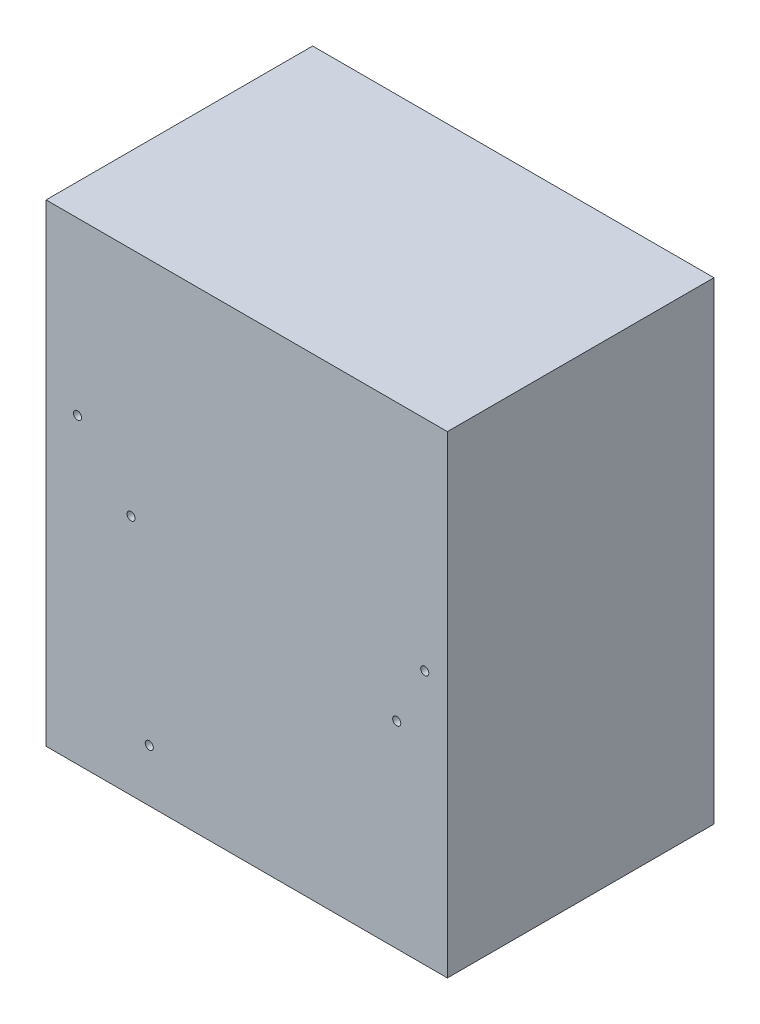
ISO-10303-21;
HEADER;
FILE_DESCRIPTION(('STEP AP214'),'2;1');
FILE_NAME('part.step','',(''),(''),'','','');
FILE_SCHEMA(('AUTOMOTIVE_DESIGN { 1 0 10303 214 1 1 1 1 }'));
ENDSEC;
DATA;
#1=APPLICATION_CONTEXT('core data for automotive mechanical design processes');
#2=APPLICATION_PROTOCOL_DEFINITION('international standard','automotive_design',2000,#1);
#3=PRODUCT_CONTEXT('',#1,'mechanical');
#4=PRODUCT('Part','Part','',(#3));
#5=PRODUCT_RELATED_PRODUCT_CATEGORY('part','',(#4));
#6=PRODUCT_DEFINITION_FORMATION('','',#4);
#7=PRODUCT_DEFINITION_CONTEXT('part definition',#1,'design');
#8=PRODUCT_DEFINITION('design','',#6,#7);
#9=PRODUCT_DEFINITION_SHAPE('','',#8);
#10=(LENGTH_UNIT() NAMED_UNIT(*) SI_UNIT(.MILLI.,.METRE.));
#11=(NAMED_UNIT(*) PLANE_ANGLE_UNIT() SI_UNIT($,.RADIAN.));
#12=(NAMED_UNIT(*) SI_UNIT($,.STERADIAN.) SOLID_ANGLE_UNIT());
#13=UNCERTAINTY_MEASURE_WITH_UNIT(LENGTH_MEASURE(1.E-05),#10,'distance_accuracy_value','');
#14=(GEOMETRIC_REPRESENTATION_CONTEXT(3) GLOBAL_UNCERTAINTY_ASSIGNED_CONTEXT((#13)) GLOBAL_UNIT_ASSIGNED_CONTEXT((#10,
#11,#12)) REPRESENTATION_CONTEXT('',''));
#15=CARTESIAN_POINT('',(0.,0.,0.));
#16=DIRECTION('',(0.,0.,1.));
#17=DIRECTION('',(1.,0.,0.));
#18=AXIS2_PLACEMENT_3D('',#15,#16,#17);
#19=CARTESIAN_POINT('',(0.,0.,0.));
#20=DIRECTION('',(0.,0.,1.));
#21=DIRECTION('',(1.,0.,0.));
#22=AXIS2_PLACEMENT_3D('',#19,#20,#21);
#23=PLANE('',#22);
#24=CARTESIAN_POINT('',(126.445833012849,81.027999610437,0.));
#25=DIRECTION('',(0.,0.,1.));
#26=DIRECTION('',(1.,0.,0.));
#27=AXIS2_PLACEMENT_3D('',#24,#25,#26);
#28=CIRCLE('',#27,1.34999999999998);
#29=CARTESIAN_POINT('',(127.795833012849,81.027999610437,0.));
#30=VERTEX_POINT('',#29);
#31=EDGE_CURVE('E189',#30,#30,#28,.T.);
#32=ORIENTED_EDGE('',*,*,#31,.T.);
#33=EDGE_LOOP('',(#32));
#34=FACE_BOUND('',#33,.T.);
#35=CARTESIAN_POINT('',(10.5006071646662,96.9224288515511,0.));
#36=DIRECTION('',(0.,0.,1.));
#37=DIRECTION('',(1.,0.,0.));
#38=AXIS2_PLACEMENT_3D('',#35,#36,#37);
#39=CIRCLE('',#38,1.34999999999998);
#40=CARTESIAN_POINT('',(11.8506071646662,96.9224288515511,0.));
#41=VERTEX_POINT('',#40);
#42=EDGE_CURVE('E186',#41,#41,#39,.T.);
#43=ORIENTED_EDGE('',*,*,#42,.T.);
#44=EDGE_LOOP('',(#43));
#45=FACE_BOUND('',#44,.T.);
#46=CARTESIAN_POINT('',(28.3817896865701,76.7422371482596,0.));
#47=DIRECTION('',(0.,0.,1.));
#48=DIRECTION('',(1.,0.,0.));
#49=AXIS2_PLACEMENT_3D('',#46,#47,#48);
#50=CIRCLE('',#49,1.34999999999998);
#51=CARTESIAN_POINT('',(29.73178968657,76.7422371482596,0.));
#52=VERTEX_POINT('',#51);
#53=EDGE_CURVE('E183',#52,#52,#50,.T.);
#54=ORIENTED_EDGE('',*,*,#53,.T.);
#55=EDGE_LOOP('',(#54));
#56=FACE_BOUND('',#55,.T.);
#57=CARTESIAN_POINT('',(117.090855830407,61.8386100308768,0.));
#58=DIRECTION('',(0.,0.,1.));
#59=DIRECTION('',(1.,0.,0.));
#60=AXIS2_PLACEMENT_3D('',#57,#58,#59);
#61=CIRCLE('',#60,1.34999999999998);
#62=CARTESIAN_POINT('',(118.440855830407,61.8386100308768,0.));
#63=VERTEX_POINT('',#62);
#64=EDGE_CURVE('E180',#63,#63,#61,.T.);
#65=ORIENTED_EDGE('',*,*,#64,.T.);
#66=EDGE_LOOP('',(#65));
#67=FACE_BOUND('',#66,.T.);
#68=CARTESIAN_POINT('',(34.4646558304072,13.5024100308762,0.));
#69=DIRECTION('',(0.,0.,1.));
#70=DIRECTION('',(1.,0.,0.));
#71=AXIS2_PLACEMENT_3D('',#68,#69,#70);
#72=CIRCLE('',#71,1.35000000000001);
#73=CARTESIAN_POINT('',(35.8146558304072,13.5024100308762,0.));
#74=VERTEX_POINT('',#73);
#75=EDGE_CURVE('E146',#74,#74,#72,.T.);
#76=ORIENTED_EDGE('',*,*,#75,.T.);
#77=EDGE_LOOP('',(#76));
#78=FACE_BOUND('',#77,.T.);
#79=DIRECTION('',(1.,0.,0.));
#80=VECTOR('',#79,1.);
#81=CARTESIAN_POINT('',(0.,0.,0.));
#82=LINE('',#81,#80);
#83=CARTESIAN_POINT('',(0.,0.,0.));
#84=VERTEX_POINT('',#83);
#85=CARTESIAN_POINT('',(130.,0.,0.));
#86=VERTEX_POINT('',#85);
#87=EDGE_CURVE('E140',#84,#86,#82,.T.);
#88=ORIENTED_EDGE('',*,*,#87,.F.);
#89=DIRECTION('',(0.,1.,0.));
#90=VECTOR('',#89,1.);
#91=CARTESIAN_POINT('',(0.,0.,0.));
#92=LINE('',#91,#90);
#93=CARTESIAN_POINT('',(0.,150.,0.));
#94=VERTEX_POINT('',#93);
#95=EDGE_CURVE('E59',#84,#94,#92,.T.);
#96=ORIENTED_EDGE('',*,*,#95,.T.);
#97=DIRECTION('',(1.,0.,0.));
#98=VECTOR('',#97,1.);
#99=CARTESIAN_POINT('',(0.,150.,0.));
#100=LINE('',#99,#98);
#101=CARTESIAN_POINT('',(130.,150.,0.));
#102=VERTEX_POINT('',#101);
#103=EDGE_CURVE('E142',#94,#102,#100,.T.);
#104=ORIENTED_EDGE('',*,*,#103,.T.);
#105=DIRECTION('',(0.,1.,0.));
#106=VECTOR('',#105,1.);
#107=CARTESIAN_POINT('',(130.,0.,0.));
#108=LINE('',#107,#106);
#109=EDGE_CURVE('E54',#86,#102,#108,.T.);
#110=ORIENTED_EDGE('',*,*,#109,.F.);
#111=EDGE_LOOP('',(#88,#96,#104,#110));
#112=FACE_BOUND('',#111,.T.);
#113=ADVANCED_FACE('F39',(#34,#45,#56,#67,#78,#112),#23,.F.);
#114=CARTESIAN_POINT('',(0.,0.,4.));
#115=DIRECTION('',(-1.,0.,0.));
#116=DIRECTION('',(0.,0.,1.));
#117=AXIS2_PLACEMENT_3D('',#114,#115,#116);
#118=PLANE('',#117);
#119=ORIENTED_EDGE('',*,*,#95,.F.);
#120=DIRECTION('',(0.,0.,1.));
#121=VECTOR('',#120,1.);
#122=CARTESIAN_POINT('',(0.,0.,-85.));
#123=LINE('',#122,#121);
#124=CARTESIAN_POINT('',(0.,0.,-85.));
#125=VERTEX_POINT('',#124);
#126=EDGE_CURVE('E102',#125,#84,#123,.T.);
#127=ORIENTED_EDGE('',*,*,#126,.F.);
#128=DIRECTION('',(0.,-1.,0.));
#129=VECTOR('',#128,1.);
#130=CARTESIAN_POINT('',(0.,0.,-85.));
#131=LINE('',#130,#129);
#132=CARTESIAN_POINT('',(0.,-4.,-85.));
#133=VERTEX_POINT('',#132);
#134=EDGE_CURVE('E106',#125,#133,#131,.T.);
#135=ORIENTED_EDGE('',*,*,#134,.T.);
#136=DIRECTION('',(0.,0.,-1.));
#137=VECTOR('',#136,1.);
#138=CARTESIAN_POINT('',(0.,-4.,4.));
#139=LINE('',#138,#137);
#140=CARTESIAN_POINT('',(0.,-4.,4.));
#141=VERTEX_POINT('',#140);
#142=EDGE_CURVE('E11',#141,#133,#139,.T.);
#143=ORIENTED_EDGE('',*,*,#142,.F.);
#144=DIRECTION('',(0.,1.,0.));
#145=VECTOR('',#144,1.);
#146=CARTESIAN_POINT('',(0.,0.,4.));
#147=LINE('',#146,#145);
#148=CARTESIAN_POINT('',(0.,154.,4.));
#149=VERTEX_POINT('',#148);
#150=EDGE_CURVE('E166',#141,#149,#147,.T.);
#151=ORIENTED_EDGE('',*,*,#150,.T.);
#152=DIRECTION('',(0.,0.,-1.));
#153=VECTOR('',#152,1.);
#154=CARTESIAN_POINT('',(0.,154.,4.));
#155=LINE('',#154,#153);
#156=CARTESIAN_POINT('',(0.,154.,-85.));
#157=VERTEX_POINT('',#156);
#158=EDGE_CURVE('E177',#149,#157,#155,.T.);
#159=ORIENTED_EDGE('',*,*,#158,.T.);
#160=DIRECTION('',(0.,1.,0.));
#161=VECTOR('',#160,1.);
#162=CARTESIAN_POINT('',(0.,0.,-85.));
#163=LINE('',#162,#161);
#164=CARTESIAN_POINT('',(0.,150.,-85.));
#165=VERTEX_POINT('',#164);
#166=EDGE_CURVE('E133',#165,#157,#163,.T.);
#167=ORIENTED_EDGE('',*,*,#166,.F.);
#168=DIRECTION('',(0.,0.,1.));
#169=VECTOR('',#168,1.);
#170=CARTESIAN_POINT('',(0.,150.,-85.));
#171=LINE('',#170,#169);
#172=EDGE_CURVE('E109',#165,#94,#171,.T.);
#173=ORIENTED_EDGE('',*,*,#172,.T.);
#174=EDGE_LOOP('',(#119,#127,#135,#143,#151,#159,#167,#173));
#175=FACE_BOUND('',#174,.T.);
#176=ADVANCED_FACE('F104',(#175),#118,.T.);
#177=CARTESIAN_POINT('',(0.,-4.,4.));
#178=DIRECTION('',(0.,1.,0.));
#179=DIRECTION('',(0.,0.,1.));
#180=AXIS2_PLACEMENT_3D('',#177,#178,#179);
#181=PLANE('',#180);
#182=ORIENTED_EDGE('',*,*,#142,.T.);
#183=DIRECTION('',(1.,0.,0.));
#184=VECTOR('',#183,1.);
#185=CARTESIAN_POINT('',(0.,-4.,-85.));
#186=LINE('',#185,#184);
#187=CARTESIAN_POINT('',(134.,-4.,-85.));
#188=VERTEX_POINT('',#187);
#189=EDGE_CURVE('E123',#133,#188,#186,.T.);
#190=ORIENTED_EDGE('',*,*,#189,.T.);
#191=DIRECTION('',(0.,0.,-1.));
#192=VECTOR('',#191,1.);
#193=CARTESIAN_POINT('',(134.,-4.,4.));
#194=LINE('',#193,#192);
#195=CARTESIAN_POINT('',(134.,-4.,4.));
#196=VERTEX_POINT('',#195);
#197=EDGE_CURVE('E47',#196,#188,#194,.T.);
#198=ORIENTED_EDGE('',*,*,#197,.F.);
#199=DIRECTION('',(1.,0.,0.));
#200=VECTOR('',#199,1.);
#201=CARTESIAN_POINT('',(0.,-4.,4.));
#202=LINE('',#201,#200);
#203=EDGE_CURVE('E169',#141,#196,#202,.T.);
#204=ORIENTED_EDGE('',*,*,#203,.F.);
#205=EDGE_LOOP('',(#182,#190,#198,#204));
#206=FACE_BOUND('',#205,.T.);
#207=ADVANCED_FACE('F202',(#206),#181,.F.);
#208=CARTESIAN_POINT('',(134.,0.,4.));
#209=DIRECTION('',(-1.,0.,0.));
#210=DIRECTION('',(0.,0.,1.));
#211=AXIS2_PLACEMENT_3D('',#208,#209,#210);
#212=PLANE('',#211);
#213=ORIENTED_EDGE('',*,*,#197,.T.);
#214=DIRECTION('',(0.,1.,0.));
#215=VECTOR('',#214,1.);
#216=CARTESIAN_POINT('',(134.,0.,-85.));
#217=LINE('',#216,#215);
#218=CARTESIAN_POINT('',(134.,154.,-85.));
#219=VERTEX_POINT('',#218);
#220=EDGE_CURVE('E125',#188,#219,#217,.T.);
#221=ORIENTED_EDGE('',*,*,#220,.T.);
#222=DIRECTION('',(0.,0.,-1.));
#223=VECTOR('',#222,1.);
#224=CARTESIAN_POINT('',(134.,154.,4.));
#225=LINE('',#224,#223);
#226=CARTESIAN_POINT('',(134.,154.,4.));
#227=VERTEX_POINT('',#226);
#228=EDGE_CURVE('E194',#227,#219,#225,.T.);
#229=ORIENTED_EDGE('',*,*,#228,.F.);
#230=DIRECTION('',(0.,1.,0.));
#231=VECTOR('',#230,1.);
#232=CARTESIAN_POINT('',(134.,0.,4.));
#233=LINE('',#232,#231);
#234=EDGE_CURVE('E172',#196,#227,#233,.T.);
#235=ORIENTED_EDGE('',*,*,#234,.F.);
#236=EDGE_LOOP('',(#213,#221,#229,#235));
#237=FACE_BOUND('',#236,.T.);
#238=ADVANCED_FACE('F197',(#237),#212,.F.);
#239=CARTESIAN_POINT('',(126.445833012849,81.027999610437,4.));
#240=DIRECTION('',(0.,0.,-1.));
#241=DIRECTION('',(-1.,0.,0.));
#242=AXIS2_PLACEMENT_3D('',#239,#240,#241);
#243=CYLINDRICAL_SURFACE('',#242,1.34999999999998);
#244=CARTESIAN_POINT('',(126.445833012849,81.027999610437,4.));
#245=DIRECTION('',(0.,0.,1.));
#246=DIRECTION('',(1.,0.,0.));
#247=AXIS2_PLACEMENT_3D('',#244,#245,#246);
#248=CIRCLE('',#247,1.34999999999998);
#249=CARTESIAN_POINT('',(127.795833012849,81.027999610437,4.));
#250=VERTEX_POINT('',#249);
#251=EDGE_CURVE('E163',#250,#250,#248,.T.);
#252=ORIENTED_EDGE('',*,*,#251,.T.);
#253=EDGE_LOOP('',(#252));
#254=FACE_BOUND('',#253,.T.);
#255=ORIENTED_EDGE('',*,*,#31,.F.);
#256=EDGE_LOOP('',(#255));
#257=FACE_BOUND('',#256,.T.);
#258=ADVANCED_FACE('F295',(#254,#257),#243,.F.);
#259=CARTESIAN_POINT('',(10.5006071646662,96.9224288515511,4.));
#260=DIRECTION('',(0.,0.,-1.));
#261=DIRECTION('',(-1.,0.,0.));
#262=AXIS2_PLACEMENT_3D('',#259,#260,#261);
#263=CYLINDRICAL_SURFACE('',#262,1.34999999999998);
#264=CARTESIAN_POINT('',(10.5006071646662,96.9224288515511,4.));
#265=DIRECTION('',(0.,0.,1.));
#266=DIRECTION('',(1.,0.,0.));
#267=AXIS2_PLACEMENT_3D('',#264,#265,#266);
#268=CIRCLE('',#267,1.34999999999998);
#269=CARTESIAN_POINT('',(11.8506071646662,96.9224288515511,4.));
#270=VERTEX_POINT('',#269);
#271=EDGE_CURVE('E160',#270,#270,#268,.T.);
#272=ORIENTED_EDGE('',*,*,#271,.T.);
#273=EDGE_LOOP('',(#272));
#274=FACE_BOUND('',#273,.T.);
#275=ORIENTED_EDGE('',*,*,#42,.F.);
#276=EDGE_LOOP('',(#275));
#277=FACE_BOUND('',#276,.T.);
#278=ADVANCED_FACE('F348',(#274,#277),#263,.F.);
#279=CARTESIAN_POINT('',(28.3817896865701,76.7422371482596,4.));
#280=DIRECTION('',(0.,0.,-1.));
#281=DIRECTION('',(-1.,0.,0.));
#282=AXIS2_PLACEMENT_3D('',#279,#280,#281);
#283=CYLINDRICAL_SURFACE('',#282,1.34999999999998);
#284=CARTESIAN_POINT('',(28.3817896865701,76.7422371482596,4.));
#285=DIRECTION('',(0.,0.,1.));
#286=DIRECTION('',(1.,0.,0.));
#287=AXIS2_PLACEMENT_3D('',#284,#285,#286);
#288=CIRCLE('',#287,1.34999999999998);
#289=CARTESIAN_POINT('',(29.73178968657,76.7422371482596,4.));
#290=VERTEX_POINT('',#289);
#291=EDGE_CURVE('E157',#290,#290,#288,.T.);
#292=ORIENTED_EDGE('',*,*,#291,.T.);
#293=EDGE_LOOP('',(#292));
#294=FACE_BOUND('',#293,.T.);
#295=ORIENTED_EDGE('',*,*,#53,.F.);
#296=EDGE_LOOP('',(#295));
#297=FACE_BOUND('',#296,.T.);
#298=ADVANCED_FACE('F338',(#294,#297),#283,.F.);
#299=CARTESIAN_POINT('',(117.090855830407,61.8386100308768,4.));
#300=DIRECTION('',(0.,0.,-1.));
#301=DIRECTION('',(-1.,0.,0.));
#302=AXIS2_PLACEMENT_3D('',#299,#300,#301);
#303=CYLINDRICAL_SURFACE('',#302,1.34999999999998);
#304=CARTESIAN_POINT('',(117.090855830407,61.8386100308768,4.));
#305=DIRECTION('',(0.,0.,1.));
#306=DIRECTION('',(1.,0.,0.));
#307=AXIS2_PLACEMENT_3D('',#304,#305,#306);
#308=CIRCLE('',#307,1.34999999999998);
#309=CARTESIAN_POINT('',(118.440855830407,61.8386100308768,4.));
#310=VERTEX_POINT('',#309);
#311=EDGE_CURVE('E154',#310,#310,#308,.T.);
#312=ORIENTED_EDGE('',*,*,#311,.T.);
#313=EDGE_LOOP('',(#312));
#314=FACE_BOUND('',#313,.T.);
#315=ORIENTED_EDGE('',*,*,#64,.F.);
#316=EDGE_LOOP('',(#315));
#317=FACE_BOUND('',#316,.T.);
#318=ADVANCED_FACE('F218',(#314,#317),#303,.F.);
#319=CARTESIAN_POINT('',(34.4646558304072,13.5024100308762,4.));
#320=DIRECTION('',(0.,0.,-1.));
#321=DIRECTION('',(-1.,0.,0.));
#322=AXIS2_PLACEMENT_3D('',#319,#320,#321);
#323=CYLINDRICAL_SURFACE('',#322,1.35000000000001);
#324=CARTESIAN_POINT('',(34.4646558304072,13.5024100308762,4.));
#325=DIRECTION('',(0.,0.,1.));
#326=DIRECTION('',(1.,0.,0.));
#327=AXIS2_PLACEMENT_3D('',#324,#325,#326);
#328=CIRCLE('',#327,1.35000000000001);
#329=CARTESIAN_POINT('',(35.8146558304072,13.5024100308762,4.));
#330=VERTEX_POINT('',#329);
#331=EDGE_CURVE('E151',#330,#330,#328,.T.);
#332=ORIENTED_EDGE('',*,*,#331,.T.);
#333=EDGE_LOOP('',(#332));
#334=FACE_BOUND('',#333,.T.);
#335=ORIENTED_EDGE('',*,*,#75,.F.);
#336=EDGE_LOOP('',(#335));
#337=FACE_BOUND('',#336,.T.);
#338=ADVANCED_FACE('F41',(#334,#337),#323,.F.);
#339=CARTESIAN_POINT('',(0.,154.,4.));
#340=DIRECTION('',(0.,1.,0.));
#341=DIRECTION('',(0.,0.,1.));
#342=AXIS2_PLACEMENT_3D('',#339,#340,#341);
#343=PLANE('',#342);
#344=ORIENTED_EDGE('',*,*,#228,.T.);
#345=DIRECTION('',(1.,0.,0.));
#346=VECTOR('',#345,1.);
#347=CARTESIAN_POINT('',(0.,154.,-85.));
#348=LINE('',#347,#346);
#349=EDGE_CURVE('E130',#157,#219,#348,.T.);
#350=ORIENTED_EDGE('',*,*,#349,.F.);
#351=ORIENTED_EDGE('',*,*,#158,.F.);
#352=DIRECTION('',(1.,0.,0.));
#353=VECTOR('',#352,1.);
#354=CARTESIAN_POINT('',(0.,154.,4.));
#355=LINE('',#354,#353);
#356=EDGE_CURVE('E174',#149,#227,#355,.T.);
#357=ORIENTED_EDGE('',*,*,#356,.T.);
#358=EDGE_LOOP('',(#344,#350,#351,#357));
#359=FACE_BOUND('',#358,.T.);
#360=ADVANCED_FACE('F209',(#359),#343,.T.);
#361=CARTESIAN_POINT('',(0.,0.,4.));
#362=DIRECTION('',(0.,0.,1.));
#363=DIRECTION('',(1.,0.,0.));
#364=AXIS2_PLACEMENT_3D('',#361,#362,#363);
#365=PLANE('',#364);
#366=ORIENTED_EDGE('',*,*,#331,.F.);
#367=EDGE_LOOP('',(#366));
#368=FACE_BOUND('',#367,.T.);
#369=ORIENTED_EDGE('',*,*,#311,.F.);
#370=EDGE_LOOP('',(#369));
#371=FACE_BOUND('',#370,.T.);
#372=ORIENTED_EDGE('',*,*,#291,.F.);
#373=EDGE_LOOP('',(#372));
#374=FACE_BOUND('',#373,.T.);
#375=ORIENTED_EDGE('',*,*,#271,.F.);
#376=EDGE_LOOP('',(#375));
#377=FACE_BOUND('',#376,.T.);
#378=ORIENTED_EDGE('',*,*,#251,.F.);
#379=EDGE_LOOP('',(#378));
#380=FACE_BOUND('',#379,.T.);
#381=ORIENTED_EDGE('',*,*,#150,.F.);
#382=ORIENTED_EDGE('',*,*,#203,.T.);
#383=ORIENTED_EDGE('',*,*,#234,.T.);
#384=ORIENTED_EDGE('',*,*,#356,.F.);
#385=EDGE_LOOP('',(#381,#382,#383,#384));
#386=FACE_BOUND('',#385,.T.);
#387=ADVANCED_FACE('F207',(#368,#371,#374,#377,#380,#386),#365,.T.);
#388=CARTESIAN_POINT('',(0.,0.,-85.));
#389=DIRECTION('',(0.,-1.,0.));
#390=DIRECTION('',(0.,0.,-1.));
#391=AXIS2_PLACEMENT_3D('',#388,#389,#390);
#392=PLANE('',#391);
#393=ORIENTED_EDGE('',*,*,#87,.T.);
#394=DIRECTION('',(0.,0.,1.));
#395=VECTOR('',#394,1.);
#396=CARTESIAN_POINT('',(130.,0.,-85.));
#397=LINE('',#396,#395);
#398=CARTESIAN_POINT('',(130.,0.,-85.));
#399=VERTEX_POINT('',#398);
#400=EDGE_CURVE('E116',#399,#86,#397,.T.);
#401=ORIENTED_EDGE('',*,*,#400,.F.);
#402=DIRECTION('',(1.,0.,0.));
#403=VECTOR('',#402,1.);
#404=CARTESIAN_POINT('',(0.,0.,-85.));
#405=LINE('',#404,#403);
#406=EDGE_CURVE('E114',#125,#399,#405,.T.);
#407=ORIENTED_EDGE('',*,*,#406,.F.);
#408=ORIENTED_EDGE('',*,*,#126,.T.);
#409=EDGE_LOOP('',(#393,#401,#407,#408));
#410=FACE_BOUND('',#409,.T.);
#411=ADVANCED_FACE('F115',(#410),#392,.F.);
#412=CARTESIAN_POINT('',(130.,0.,-85.));
#413=DIRECTION('',(1.,0.,0.));
#414=DIRECTION('',(0.,0.,-1.));
#415=AXIS2_PLACEMENT_3D('',#412,#413,#414);
#416=PLANE('',#415);
#417=ORIENTED_EDGE('',*,*,#109,.T.);
#418=DIRECTION('',(0.,0.,1.));
#419=VECTOR('',#418,1.);
#420=CARTESIAN_POINT('',(130.,150.,-85.));
#421=LINE('',#420,#419);
#422=CARTESIAN_POINT('',(130.,150.,-85.));
#423=VERTEX_POINT('',#422);
#424=EDGE_CURVE('E147',#423,#102,#421,.T.);
#425=ORIENTED_EDGE('',*,*,#424,.F.);
#426=DIRECTION('',(0.,1.,0.));
#427=VECTOR('',#426,1.);
#428=CARTESIAN_POINT('',(130.,0.,-85.));
#429=LINE('',#428,#427);
#430=EDGE_CURVE('E110',#399,#423,#429,.T.);
#431=ORIENTED_EDGE('',*,*,#430,.F.);
#432=ORIENTED_EDGE('',*,*,#400,.T.);
#433=EDGE_LOOP('',(#417,#425,#431,#432));
#434=FACE_BOUND('',#433,.T.);
#435=ADVANCED_FACE('F232',(#434),#416,.F.);
#436=CARTESIAN_POINT('',(0.,150.,-85.));
#437=DIRECTION('',(0.,-1.,0.));
#438=DIRECTION('',(0.,0.,-1.));
#439=AXIS2_PLACEMENT_3D('',#436,#437,#438);
#440=PLANE('',#439);
#441=ORIENTED_EDGE('',*,*,#103,.F.);
#442=ORIENTED_EDGE('',*,*,#172,.F.);
#443=DIRECTION('',(1.,0.,0.));
#444=VECTOR('',#443,1.);
#445=CARTESIAN_POINT('',(0.,150.,-85.));
#446=LINE('',#445,#444);
#447=EDGE_CURVE('E136',#165,#423,#446,.T.);
#448=ORIENTED_EDGE('',*,*,#447,.T.);
#449=ORIENTED_EDGE('',*,*,#424,.T.);
#450=EDGE_LOOP('',(#441,#442,#448,#449));
#451=FACE_BOUND('',#450,.T.);
#452=ADVANCED_FACE('F233',(#451),#440,.T.);
#453=CARTESIAN_POINT('',(0.,0.,-85.));
#454=DIRECTION('',(0.,0.,1.));
#455=DIRECTION('',(1.,0.,0.));
#456=AXIS2_PLACEMENT_3D('',#453,#454,#455);
#457=PLANE('',#456);
#458=ORIENTED_EDGE('',*,*,#406,.T.);
#459=ORIENTED_EDGE('',*,*,#430,.T.);
#460=ORIENTED_EDGE('',*,*,#447,.F.);
#461=ORIENTED_EDGE('',*,*,#166,.T.);
#462=ORIENTED_EDGE('',*,*,#349,.T.);
#463=ORIENTED_EDGE('',*,*,#220,.F.);
#464=ORIENTED_EDGE('',*,*,#189,.F.);
#465=ORIENTED_EDGE('',*,*,#134,.F.);
#466=EDGE_LOOP('',(#458,#459,#460,#461,#462,#463,#464,#465));
#467=FACE_BOUND('',#466,.T.);
#468=ADVANCED_FACE('F120',(#467),#457,.F.);
#469=CLOSED_SHELL('',(#113,#176,#207,#238,#258,#278,#298,#318,#338,#360,#387,#411,#435,#452,#468));
#470=MANIFOLD_SOLID_BREP('B2',#469);
#471=ADVANCED_BREP_SHAPE_REPRESENTATION('',(#18,#470),#14);
#472=SHAPE_DEFINITION_REPRESENTATION(#9,#471);
ENDSEC;
END-ISO-10303-21;
